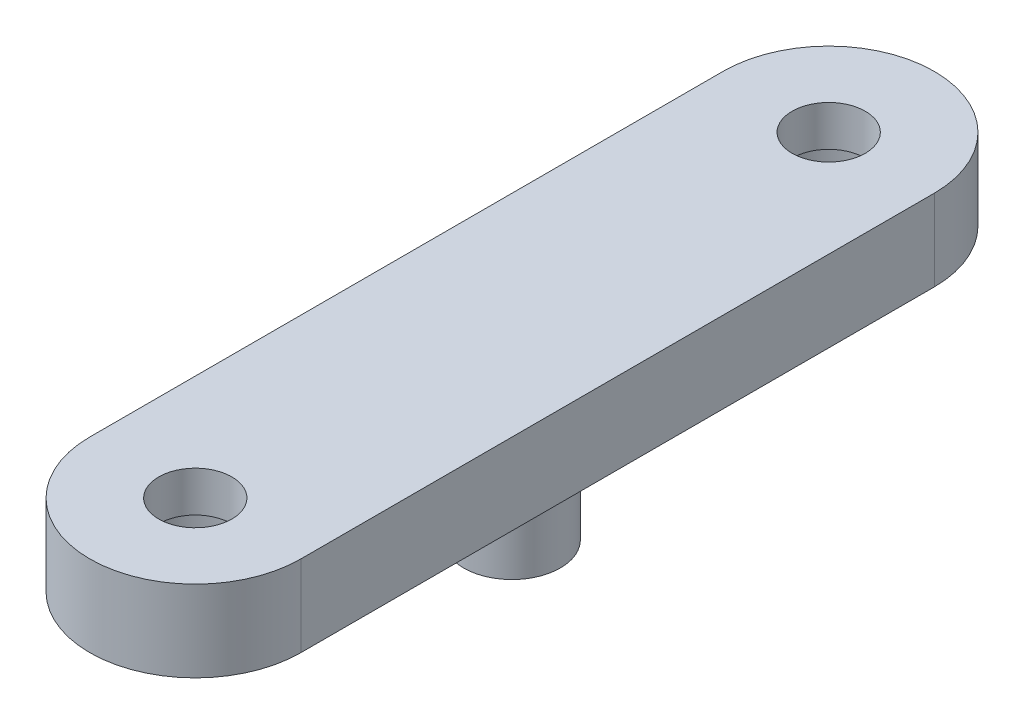
ISO-10303-21;
HEADER;
FILE_DESCRIPTION(('STEP AP214'),'2;1');
FILE_NAME('part.step','',(''),(''),'','','');
FILE_SCHEMA(('AUTOMOTIVE_DESIGN { 1 0 10303 214 1 1 1 1 }'));
ENDSEC;
DATA;
#1=APPLICATION_CONTEXT('core data for automotive mechanical design processes');
#2=APPLICATION_PROTOCOL_DEFINITION('international standard','automotive_design',2000,#1);
#3=PRODUCT_CONTEXT('',#1,'mechanical');
#4=PRODUCT('Part','Part','',(#3));
#5=PRODUCT_RELATED_PRODUCT_CATEGORY('part','',(#4));
#6=PRODUCT_DEFINITION_FORMATION('','',#4);
#7=PRODUCT_DEFINITION_CONTEXT('part definition',#1,'design');
#8=PRODUCT_DEFINITION('design','',#6,#7);
#9=PRODUCT_DEFINITION_SHAPE('','',#8);
#10=(LENGTH_UNIT() NAMED_UNIT(*) SI_UNIT(.MILLI.,.METRE.));
#11=(NAMED_UNIT(*) PLANE_ANGLE_UNIT() SI_UNIT($,.RADIAN.));
#12=(NAMED_UNIT(*) SI_UNIT($,.STERADIAN.) SOLID_ANGLE_UNIT());
#13=UNCERTAINTY_MEASURE_WITH_UNIT(LENGTH_MEASURE(1.E-05),#10,'distance_accuracy_value','');
#14=(GEOMETRIC_REPRESENTATION_CONTEXT(3) GLOBAL_UNCERTAINTY_ASSIGNED_CONTEXT((#13)) GLOBAL_UNIT_ASSIGNED_CONTEXT((#10,
#11,#12)) REPRESENTATION_CONTEXT('',''));
#15=CARTESIAN_POINT('',(0.,0.,0.));
#16=DIRECTION('',(0.,0.,1.));
#17=DIRECTION('',(1.,0.,0.));
#18=AXIS2_PLACEMENT_3D('',#15,#16,#17);
#19=CARTESIAN_POINT('',(6.5,-52.75,349.5));
#20=DIRECTION('',(-1.,0.,0.));
#21=DIRECTION('',(0.,0.,1.));
#22=AXIS2_PLACEMENT_3D('',#19,#20,#21);
#23=PLANE('',#22);
#24=DIRECTION('',(0.,0.,-1.));
#25=VECTOR('',#24,1.);
#26=CARTESIAN_POINT('',(6.5,-57.75,349.5));
#27=LINE('',#26,#25);
#28=CARTESIAN_POINT('',(6.5,-57.75,349.5));
#29=VERTEX_POINT('',#28);
#30=CARTESIAN_POINT('',(6.5,-57.75,310.5));
#31=VERTEX_POINT('',#30);
#32=EDGE_CURVE('E92',#29,#31,#27,.T.);
#33=ORIENTED_EDGE('',*,*,#32,.T.);
#34=DIRECTION('',(0.,-1.,0.));
#35=VECTOR('',#34,1.);
#36=CARTESIAN_POINT('',(6.5,-52.75,310.5));
#37=LINE('',#36,#35);
#38=CARTESIAN_POINT('',(6.5,-52.75,310.5));
#39=VERTEX_POINT('',#38);
#40=EDGE_CURVE('E11',#39,#31,#37,.T.);
#41=ORIENTED_EDGE('',*,*,#40,.F.);
#42=DIRECTION('',(0.,0.,-1.));
#43=VECTOR('',#42,1.);
#44=CARTESIAN_POINT('',(6.5,-52.75,349.5));
#45=LINE('',#44,#43);
#46=CARTESIAN_POINT('',(6.5,-52.75,349.5));
#47=VERTEX_POINT('',#46);
#48=EDGE_CURVE('E64',#47,#39,#45,.T.);
#49=ORIENTED_EDGE('',*,*,#48,.F.);
#50=DIRECTION('',(0.,-1.,0.));
#51=VECTOR('',#50,1.);
#52=CARTESIAN_POINT('',(6.5,-52.75,349.5));
#53=LINE('',#52,#51);
#54=EDGE_CURVE('E102',#47,#29,#53,.T.);
#55=ORIENTED_EDGE('',*,*,#54,.T.);
#56=EDGE_LOOP('',(#33,#41,#49,#55));
#57=FACE_BOUND('',#56,.T.);
#58=ADVANCED_FACE('F43',(#57),#23,.F.);
#59=CARTESIAN_POINT('',(-6.5,-52.75,349.5));
#60=DIRECTION('',(1.,0.,0.));
#61=DIRECTION('',(0.,0.,-1.));
#62=AXIS2_PLACEMENT_3D('',#59,#60,#61);
#63=PLANE('',#62);
#64=DIRECTION('',(0.,0.,1.));
#65=VECTOR('',#64,1.);
#66=CARTESIAN_POINT('',(-6.5,-57.75,349.5));
#67=LINE('',#66,#65);
#68=CARTESIAN_POINT('',(-6.5,-57.75,310.5));
#69=VERTEX_POINT('',#68);
#70=CARTESIAN_POINT('',(-6.5,-57.75,349.5));
#71=VERTEX_POINT('',#70);
#72=EDGE_CURVE('E88',#69,#71,#67,.T.);
#73=ORIENTED_EDGE('',*,*,#72,.T.);
#74=DIRECTION('',(0.,-1.,0.));
#75=VECTOR('',#74,1.);
#76=CARTESIAN_POINT('',(-6.5,-52.75,349.5));
#77=LINE('',#76,#75);
#78=CARTESIAN_POINT('',(-6.5,-52.75,349.5));
#79=VERTEX_POINT('',#78);
#80=EDGE_CURVE('E89',#79,#71,#77,.T.);
#81=ORIENTED_EDGE('',*,*,#80,.F.);
#82=DIRECTION('',(0.,0.,1.));
#83=VECTOR('',#82,1.);
#84=CARTESIAN_POINT('',(-6.5,-52.75,349.5));
#85=LINE('',#84,#83);
#86=CARTESIAN_POINT('',(-6.5,-52.75,310.5));
#87=VERTEX_POINT('',#86);
#88=EDGE_CURVE('E124',#87,#79,#85,.T.);
#89=ORIENTED_EDGE('',*,*,#88,.F.);
#90=DIRECTION('',(0.,-1.,0.));
#91=VECTOR('',#90,1.);
#92=CARTESIAN_POINT('',(-6.5,-52.75,310.5));
#93=LINE('',#92,#91);
#94=EDGE_CURVE('E52',#87,#69,#93,.T.);
#95=ORIENTED_EDGE('',*,*,#94,.T.);
#96=EDGE_LOOP('',(#73,#81,#89,#95));
#97=FACE_BOUND('',#96,.T.);
#98=ADVANCED_FACE('F86',(#97),#63,.F.);
#99=CARTESIAN_POINT('',(0.,-52.75,0.));
#100=DIRECTION('',(0.,-1.,0.));
#101=DIRECTION('',(0.,0.,-1.));
#102=AXIS2_PLACEMENT_3D('',#99,#100,#101);
#103=PLANE('',#102);
#104=CARTESIAN_POINT('',(0.,-52.75,310.5));
#105=DIRECTION('',(0.,1.,0.));
#106=DIRECTION('',(0.,0.,1.));
#107=AXIS2_PLACEMENT_3D('',#104,#105,#106);
#108=CIRCLE('',#107,2.25);
#109=CARTESIAN_POINT('',(0.,-52.75,312.75));
#110=VERTEX_POINT('',#109);
#111=EDGE_CURVE('E160',#110,#110,#108,.T.);
#112=ORIENTED_EDGE('',*,*,#111,.F.);
#113=EDGE_LOOP('',(#112));
#114=FACE_BOUND('',#113,.T.);
#115=CARTESIAN_POINT('',(0.,-52.75,349.5));
#116=DIRECTION('',(0.,1.,0.));
#117=DIRECTION('',(0.,0.,1.));
#118=AXIS2_PLACEMENT_3D('',#115,#116,#117);
#119=CIRCLE('',#118,2.25);
#120=CARTESIAN_POINT('',(0.,-52.75,351.75));
#121=VERTEX_POINT('',#120);
#122=EDGE_CURVE('E139',#121,#121,#119,.T.);
#123=ORIENTED_EDGE('',*,*,#122,.F.);
#124=EDGE_LOOP('',(#123));
#125=FACE_BOUND('',#124,.T.);
#126=ORIENTED_EDGE('',*,*,#48,.T.);
#127=CARTESIAN_POINT('',(0.,-52.75,310.5));
#128=DIRECTION('',(0.,1.,0.));
#129=DIRECTION('',(0.,0.,1.));
#130=AXIS2_PLACEMENT_3D('',#127,#128,#129);
#131=CIRCLE('',#130,6.5);
#132=EDGE_CURVE('E111',#39,#87,#131,.T.);
#133=ORIENTED_EDGE('',*,*,#132,.T.);
#134=ORIENTED_EDGE('',*,*,#88,.T.);
#135=CARTESIAN_POINT('',(0.,-52.75,349.5));
#136=DIRECTION('',(0.,1.,0.));
#137=DIRECTION('',(0.,0.,1.));
#138=AXIS2_PLACEMENT_3D('',#135,#136,#137);
#139=CIRCLE('',#138,6.5);
#140=EDGE_CURVE('E105',#79,#47,#139,.T.);
#141=ORIENTED_EDGE('',*,*,#140,.T.);
#142=EDGE_LOOP('',(#126,#133,#134,#141));
#143=FACE_BOUND('',#142,.T.);
#144=ADVANCED_FACE('F174',(#114,#125,#143),#103,.F.);
#145=CARTESIAN_POINT('',(0.,-57.75,0.));
#146=DIRECTION('',(0.,-1.,0.));
#147=DIRECTION('',(0.,0.,-1.));
#148=AXIS2_PLACEMENT_3D('',#145,#146,#147);
#149=PLANE('',#148);
#150=CARTESIAN_POINT('',(0.,-57.75,310.5));
#151=DIRECTION('',(0.,1.,0.));
#152=DIRECTION('',(0.,0.,1.));
#153=AXIS2_PLACEMENT_3D('',#150,#151,#152);
#154=CIRCLE('',#153,4.2);
#155=CARTESIAN_POINT('',(0.,-57.75,314.7));
#156=VERTEX_POINT('',#155);
#157=EDGE_CURVE('E143',#156,#156,#154,.T.);
#158=ORIENTED_EDGE('',*,*,#157,.T.);
#159=EDGE_LOOP('',(#158));
#160=FACE_BOUND('',#159,.T.);
#161=CARTESIAN_POINT('',(0.,-57.75,349.5));
#162=DIRECTION('',(0.,1.,0.));
#163=DIRECTION('',(0.,0.,1.));
#164=AXIS2_PLACEMENT_3D('',#161,#162,#163);
#165=CIRCLE('',#164,4.2);
#166=CARTESIAN_POINT('',(0.,-57.75,353.7));
#167=VERTEX_POINT('',#166);
#168=EDGE_CURVE('E146',#167,#167,#165,.T.);
#169=ORIENTED_EDGE('',*,*,#168,.T.);
#170=EDGE_LOOP('',(#169));
#171=FACE_BOUND('',#170,.T.);
#172=CARTESIAN_POINT('',(0.,-57.75,330.));
#173=DIRECTION('',(0.,1.,0.));
#174=DIRECTION('',(0.,0.,1.));
#175=AXIS2_PLACEMENT_3D('',#172,#173,#174);
#176=CIRCLE('',#175,2.975);
#177=CARTESIAN_POINT('',(0.,-57.75,332.975));
#178=VERTEX_POINT('',#177);
#179=EDGE_CURVE('E119',#178,#178,#176,.T.);
#180=ORIENTED_EDGE('',*,*,#179,.T.);
#181=EDGE_LOOP('',(#180));
#182=FACE_BOUND('',#181,.T.);
#183=ORIENTED_EDGE('',*,*,#72,.F.);
#184=CARTESIAN_POINT('',(0.,-57.75,310.5));
#185=DIRECTION('',(0.,1.,0.));
#186=DIRECTION('',(0.,0.,1.));
#187=AXIS2_PLACEMENT_3D('',#184,#185,#186);
#188=CIRCLE('',#187,6.5);
#189=EDGE_CURVE('E71',#31,#69,#188,.T.);
#190=ORIENTED_EDGE('',*,*,#189,.F.);
#191=ORIENTED_EDGE('',*,*,#32,.F.);
#192=CARTESIAN_POINT('',(0.,-57.75,349.5));
#193=DIRECTION('',(0.,1.,0.));
#194=DIRECTION('',(0.,0.,1.));
#195=AXIS2_PLACEMENT_3D('',#192,#193,#194);
#196=CIRCLE('',#195,6.5);
#197=EDGE_CURVE('E99',#71,#29,#196,.T.);
#198=ORIENTED_EDGE('',*,*,#197,.F.);
#199=EDGE_LOOP('',(#183,#190,#191,#198));
#200=FACE_BOUND('',#199,.T.);
#201=ADVANCED_FACE('F110',(#160,#171,#182,#200),#149,.T.);
#202=CARTESIAN_POINT('',(0.,-52.75,349.5));
#203=DIRECTION('',(0.,-1.,0.));
#204=DIRECTION('',(0.,0.,-1.));
#205=AXIS2_PLACEMENT_3D('',#202,#203,#204);
#206=CYLINDRICAL_SURFACE('',#205,6.5);
#207=ORIENTED_EDGE('',*,*,#197,.T.);
#208=ORIENTED_EDGE('',*,*,#54,.F.);
#209=ORIENTED_EDGE('',*,*,#140,.F.);
#210=ORIENTED_EDGE('',*,*,#80,.T.);
#211=EDGE_LOOP('',(#207,#208,#209,#210));
#212=FACE_BOUND('',#211,.T.);
#213=ADVANCED_FACE('F97',(#212),#206,.T.);
#214=CARTESIAN_POINT('',(0.,-52.75,310.5));
#215=DIRECTION('',(0.,-1.,0.));
#216=DIRECTION('',(0.,0.,-1.));
#217=AXIS2_PLACEMENT_3D('',#214,#215,#216);
#218=CYLINDRICAL_SURFACE('',#217,6.5);
#219=ORIENTED_EDGE('',*,*,#132,.F.);
#220=ORIENTED_EDGE('',*,*,#40,.T.);
#221=ORIENTED_EDGE('',*,*,#189,.T.);
#222=ORIENTED_EDGE('',*,*,#94,.F.);
#223=EDGE_LOOP('',(#219,#220,#221,#222));
#224=FACE_BOUND('',#223,.T.);
#225=ADVANCED_FACE('F175',(#224),#218,.T.);
#226=CARTESIAN_POINT('',(0.,-57.75,330.));
#227=DIRECTION('',(0.,-1.,0.));
#228=DIRECTION('',(0.,0.,-1.));
#229=AXIS2_PLACEMENT_3D('',#226,#227,#228);
#230=CYLINDRICAL_SURFACE('',#229,2.975);
#231=ORIENTED_EDGE('',*,*,#179,.F.);
#232=EDGE_LOOP('',(#231));
#233=FACE_BOUND('',#232,.T.);
#234=CARTESIAN_POINT('',(0.,-64.75,330.));
#235=DIRECTION('',(0.,1.,0.));
#236=DIRECTION('',(0.,0.,1.));
#237=AXIS2_PLACEMENT_3D('',#234,#235,#236);
#238=CIRCLE('',#237,2.975);
#239=CARTESIAN_POINT('',(0.,-64.75,332.975));
#240=VERTEX_POINT('',#239);
#241=EDGE_CURVE('E161',#240,#240,#238,.T.);
#242=ORIENTED_EDGE('',*,*,#241,.T.);
#243=EDGE_LOOP('',(#242));
#244=FACE_BOUND('',#243,.T.);
#245=ADVANCED_FACE('F173',(#233,#244),#230,.T.);
#246=CARTESIAN_POINT('',(0.,-64.75,330.));
#247=DIRECTION('',(0.,1.,0.));
#248=DIRECTION('',(0.,0.,1.));
#249=AXIS2_PLACEMENT_3D('',#246,#247,#248);
#250=PLANE('',#249);
#251=ORIENTED_EDGE('',*,*,#241,.F.);
#252=EDGE_LOOP('',(#251));
#253=FACE_BOUND('',#252,.T.);
#254=ADVANCED_FACE('F178',(#253),#250,.F.);
#255=CARTESIAN_POINT('',(0.,-52.75,349.5));
#256=DIRECTION('',(0.,-1.,0.));
#257=DIRECTION('',(0.,0.,-1.));
#258=AXIS2_PLACEMENT_3D('',#255,#256,#257);
#259=CYLINDRICAL_SURFACE('',#258,2.25);
#260=CARTESIAN_POINT('',(0.,-55.25,349.5));
#261=DIRECTION('',(0.,1.,0.));
#262=DIRECTION('',(0.,0.,1.));
#263=AXIS2_PLACEMENT_3D('',#260,#261,#262);
#264=CIRCLE('',#263,2.25);
#265=CARTESIAN_POINT('',(0.,-55.25,351.75));
#266=VERTEX_POINT('',#265);
#267=EDGE_CURVE('E46',#266,#266,#264,.T.);
#268=ORIENTED_EDGE('',*,*,#267,.F.);
#269=EDGE_LOOP('',(#268));
#270=FACE_BOUND('',#269,.T.);
#271=ORIENTED_EDGE('',*,*,#122,.T.);
#272=EDGE_LOOP('',(#271));
#273=FACE_BOUND('',#272,.T.);
#274=ADVANCED_FACE('F204',(#270,#273),#259,.F.);
#275=CARTESIAN_POINT('',(0.,-52.75,310.5));
#276=DIRECTION('',(0.,-1.,0.));
#277=DIRECTION('',(0.,0.,-1.));
#278=AXIS2_PLACEMENT_3D('',#275,#276,#277);
#279=CYLINDRICAL_SURFACE('',#278,2.25);
#280=CARTESIAN_POINT('',(0.,-55.25,310.5));
#281=DIRECTION('',(0.,1.,0.));
#282=DIRECTION('',(0.,0.,1.));
#283=AXIS2_PLACEMENT_3D('',#280,#281,#282);
#284=CIRCLE('',#283,2.25);
#285=CARTESIAN_POINT('',(0.,-55.25,312.75));
#286=VERTEX_POINT('',#285);
#287=EDGE_CURVE('E129',#286,#286,#284,.T.);
#288=ORIENTED_EDGE('',*,*,#287,.F.);
#289=EDGE_LOOP('',(#288));
#290=FACE_BOUND('',#289,.T.);
#291=ORIENTED_EDGE('',*,*,#111,.T.);
#292=EDGE_LOOP('',(#291));
#293=FACE_BOUND('',#292,.T.);
#294=ADVANCED_FACE('F208',(#290,#293),#279,.F.);
#295=CARTESIAN_POINT('',(0.,-55.25,310.5));
#296=DIRECTION('',(0.,-1.,0.));
#297=DIRECTION('',(0.,0.,-1.));
#298=AXIS2_PLACEMENT_3D('',#295,#296,#297);
#299=CYLINDRICAL_SURFACE('',#298,4.2);
#300=CARTESIAN_POINT('',(0.,-55.25,310.5));
#301=DIRECTION('',(0.,1.,0.));
#302=DIRECTION('',(0.,0.,1.));
#303=AXIS2_PLACEMENT_3D('',#300,#301,#302);
#304=CIRCLE('',#303,4.2);
#305=CARTESIAN_POINT('',(0.,-55.25,314.7));
#306=VERTEX_POINT('',#305);
#307=EDGE_CURVE('E134',#306,#306,#304,.T.);
#308=ORIENTED_EDGE('',*,*,#307,.T.);
#309=EDGE_LOOP('',(#308));
#310=FACE_BOUND('',#309,.T.);
#311=ORIENTED_EDGE('',*,*,#157,.F.);
#312=EDGE_LOOP('',(#311));
#313=FACE_BOUND('',#312,.T.);
#314=ADVANCED_FACE('F212',(#310,#313),#299,.F.);
#315=CARTESIAN_POINT('',(0.,-55.25,310.5));
#316=DIRECTION('',(0.,1.,0.));
#317=DIRECTION('',(0.,0.,1.));
#318=AXIS2_PLACEMENT_3D('',#315,#316,#317);
#319=PLANE('',#318);
#320=ORIENTED_EDGE('',*,*,#287,.T.);
#321=EDGE_LOOP('',(#320));
#322=FACE_BOUND('',#321,.T.);
#323=ORIENTED_EDGE('',*,*,#307,.F.);
#324=EDGE_LOOP('',(#323));
#325=FACE_BOUND('',#324,.T.);
#326=ADVANCED_FACE('F224',(#322,#325),#319,.F.);
#327=CARTESIAN_POINT('',(0.,-55.25,349.5));
#328=DIRECTION('',(0.,-1.,0.));
#329=DIRECTION('',(0.,0.,-1.));
#330=AXIS2_PLACEMENT_3D('',#327,#328,#329);
#331=CYLINDRICAL_SURFACE('',#330,4.2);
#332=CARTESIAN_POINT('',(0.,-55.25,349.5));
#333=DIRECTION('',(0.,1.,0.));
#334=DIRECTION('',(0.,0.,1.));
#335=AXIS2_PLACEMENT_3D('',#332,#333,#334);
#336=CIRCLE('',#335,4.2);
#337=CARTESIAN_POINT('',(0.,-55.25,353.7));
#338=VERTEX_POINT('',#337);
#339=EDGE_CURVE('E153',#338,#338,#336,.T.);
#340=ORIENTED_EDGE('',*,*,#339,.T.);
#341=EDGE_LOOP('',(#340));
#342=FACE_BOUND('',#341,.T.);
#343=ORIENTED_EDGE('',*,*,#168,.F.);
#344=EDGE_LOOP('',(#343));
#345=FACE_BOUND('',#344,.T.);
#346=ADVANCED_FACE('F218',(#342,#345),#331,.F.);
#347=CARTESIAN_POINT('',(0.,-55.25,349.5));
#348=DIRECTION('',(0.,1.,0.));
#349=DIRECTION('',(0.,0.,1.));
#350=AXIS2_PLACEMENT_3D('',#347,#348,#349);
#351=PLANE('',#350);
#352=ORIENTED_EDGE('',*,*,#267,.T.);
#353=EDGE_LOOP('',(#352));
#354=FACE_BOUND('',#353,.T.);
#355=ORIENTED_EDGE('',*,*,#339,.F.);
#356=EDGE_LOOP('',(#355));
#357=FACE_BOUND('',#356,.T.);
#358=ADVANCED_FACE('F216',(#354,#357),#351,.F.);
#359=CLOSED_SHELL('',(#58,#98,#144,#201,#213,#225,#245,#254,#274,#294,#314,#326,#346,#358));
#360=MANIFOLD_SOLID_BREP('B2',#359);
#361=ADVANCED_BREP_SHAPE_REPRESENTATION('',(#18,#360),#14);
#362=SHAPE_DEFINITION_REPRESENTATION(#9,#361);
ENDSEC;
END-ISO-10303-21;
